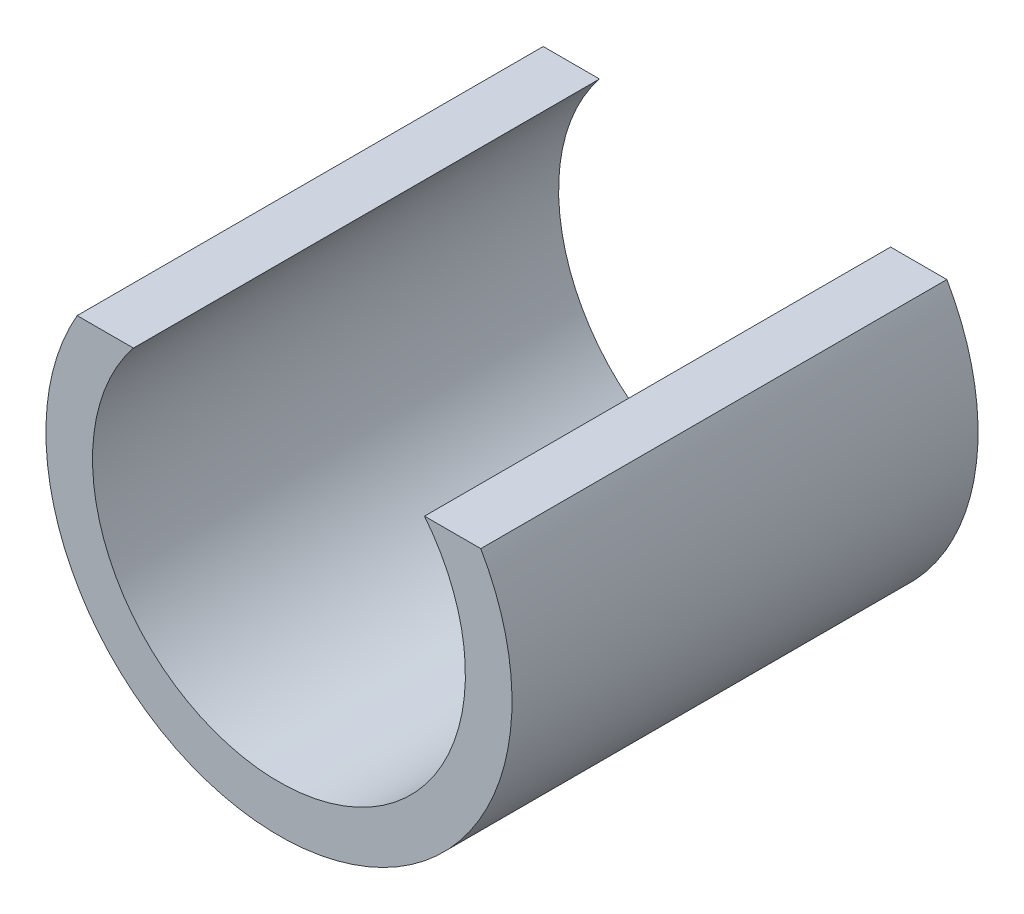
ISO-10303-21;
HEADER;
FILE_DESCRIPTION(('STEP AP214'),'2;1');
FILE_NAME('part.step','',(''),(''),'','','');
FILE_SCHEMA(('AUTOMOTIVE_DESIGN { 1 0 10303 214 1 1 1 1 }'));
ENDSEC;
DATA;
#1=APPLICATION_CONTEXT('core data for automotive mechanical design processes');
#2=APPLICATION_PROTOCOL_DEFINITION('international standard','automotive_design',2000,#1);
#3=PRODUCT_CONTEXT('',#1,'mechanical');
#4=PRODUCT('Part','Part','',(#3));
#5=PRODUCT_RELATED_PRODUCT_CATEGORY('part','',(#4));
#6=PRODUCT_DEFINITION_FORMATION('','',#4);
#7=PRODUCT_DEFINITION_CONTEXT('part definition',#1,'design');
#8=PRODUCT_DEFINITION('design','',#6,#7);
#9=PRODUCT_DEFINITION_SHAPE('','',#8);
#10=(LENGTH_UNIT() NAMED_UNIT(*) SI_UNIT(.MILLI.,.METRE.));
#11=(NAMED_UNIT(*) PLANE_ANGLE_UNIT() SI_UNIT($,.RADIAN.));
#12=(NAMED_UNIT(*) SI_UNIT($,.STERADIAN.) SOLID_ANGLE_UNIT());
#13=UNCERTAINTY_MEASURE_WITH_UNIT(LENGTH_MEASURE(1.E-05),#10,'distance_accuracy_value','');
#14=(GEOMETRIC_REPRESENTATION_CONTEXT(3) GLOBAL_UNCERTAINTY_ASSIGNED_CONTEXT((#13)) GLOBAL_UNIT_ASSIGNED_CONTEXT((#10,
#11,#12)) REPRESENTATION_CONTEXT('',''));
#15=CARTESIAN_POINT('',(0.,0.,0.));
#16=DIRECTION('',(0.,0.,1.));
#17=DIRECTION('',(1.,0.,0.));
#18=AXIS2_PLACEMENT_3D('',#15,#16,#17);
#19=CARTESIAN_POINT('',(0.,0.,4.));
#20=DIRECTION('',(0.,0.,-1.));
#21=DIRECTION('',(-1.,0.,0.));
#22=AXIS2_PLACEMENT_3D('',#19,#20,#21);
#23=CYLINDRICAL_SURFACE('',#22,1.6);
#24=CARTESIAN_POINT('',(0.,0.,0.));
#25=DIRECTION('',(0.,0.,1.));
#26=DIRECTION('',(1.,0.,0.));
#27=AXIS2_PLACEMENT_3D('',#24,#25,#26);
#28=CIRCLE('',#27,1.6);
#29=CARTESIAN_POINT('',(-1.24899959967968,1.,0.));
#30=VERTEX_POINT('',#29);
#31=CARTESIAN_POINT('',(1.24899959967968,1.,0.));
#32=VERTEX_POINT('',#31);
#33=EDGE_CURVE('E98',#30,#32,#28,.T.);
#34=ORIENTED_EDGE('',*,*,#33,.F.);
#35=DIRECTION('',(0.,0.,-1.));
#36=VECTOR('',#35,1.);
#37=CARTESIAN_POINT('',(-1.24899959967968,1.,4.));
#38=LINE('',#37,#36);
#39=CARTESIAN_POINT('',(-1.24899959967968,1.,4.));
#40=VERTEX_POINT('',#39);
#41=EDGE_CURVE('E11',#40,#30,#38,.T.);
#42=ORIENTED_EDGE('',*,*,#41,.F.);
#43=CARTESIAN_POINT('',(0.,0.,4.));
#44=DIRECTION('',(0.,0.,1.));
#45=DIRECTION('',(1.,0.,0.));
#46=AXIS2_PLACEMENT_3D('',#43,#44,#45);
#47=CIRCLE('',#46,1.6);
#48=CARTESIAN_POINT('',(1.24899959967968,1.,4.));
#49=VERTEX_POINT('',#48);
#50=EDGE_CURVE('E87',#40,#49,#47,.T.);
#51=ORIENTED_EDGE('',*,*,#50,.T.);
#52=DIRECTION('',(0.,0.,-1.));
#53=VECTOR('',#52,1.);
#54=CARTESIAN_POINT('',(1.24899959967968,1.,4.));
#55=LINE('',#54,#53);
#56=EDGE_CURVE('E76',#49,#32,#55,.T.);
#57=ORIENTED_EDGE('',*,*,#56,.T.);
#58=EDGE_LOOP('',(#34,#42,#51,#57));
#59=FACE_BOUND('',#58,.T.);
#60=ADVANCED_FACE('F37',(#59),#23,.F.);
#61=CARTESIAN_POINT('',(0.,1.,4.));
#62=DIRECTION('',(0.,-1.,0.));
#63=DIRECTION('',(0.,0.,-1.));
#64=AXIS2_PLACEMENT_3D('',#61,#62,#63);
#65=PLANE('',#64);
#66=DIRECTION('',(-1.,0.,0.));
#67=VECTOR('',#66,1.);
#68=CARTESIAN_POINT('',(0.,1.,0.));
#69=LINE('',#68,#67);
#70=CARTESIAN_POINT('',(-1.73205080756888,1.,0.));
#71=VERTEX_POINT('',#70);
#72=EDGE_CURVE('E92',#30,#71,#69,.T.);
#73=ORIENTED_EDGE('',*,*,#72,.T.);
#74=DIRECTION('',(0.,0.,-1.));
#75=VECTOR('',#74,1.);
#76=CARTESIAN_POINT('',(-1.73205080756888,1.,4.));
#77=LINE('',#76,#75);
#78=CARTESIAN_POINT('',(-1.73205080756888,1.,4.));
#79=VERTEX_POINT('',#78);
#80=EDGE_CURVE('E45',#79,#71,#77,.T.);
#81=ORIENTED_EDGE('',*,*,#80,.F.);
#82=DIRECTION('',(-1.,0.,0.));
#83=VECTOR('',#82,1.);
#84=CARTESIAN_POINT('',(0.,1.,4.));
#85=LINE('',#84,#83);
#86=EDGE_CURVE('E82',#40,#79,#85,.T.);
#87=ORIENTED_EDGE('',*,*,#86,.F.);
#88=ORIENTED_EDGE('',*,*,#41,.T.);
#89=EDGE_LOOP('',(#73,#81,#87,#88));
#90=FACE_BOUND('',#89,.T.);
#91=ADVANCED_FACE('F90',(#90),#65,.F.);
#92=CARTESIAN_POINT('',(0.,0.,4.));
#93=DIRECTION('',(0.,0.,-1.));
#94=DIRECTION('',(-1.,0.,0.));
#95=AXIS2_PLACEMENT_3D('',#92,#93,#94);
#96=CYLINDRICAL_SURFACE('',#95,2.);
#97=CARTESIAN_POINT('',(0.,0.,0.));
#98=DIRECTION('',(0.,0.,1.));
#99=DIRECTION('',(1.,0.,0.));
#100=AXIS2_PLACEMENT_3D('',#97,#98,#99);
#101=CIRCLE('',#100,2.);
#102=CARTESIAN_POINT('',(1.73205080756888,1.,0.));
#103=VERTEX_POINT('',#102);
#104=EDGE_CURVE('E69',#71,#103,#101,.T.);
#105=ORIENTED_EDGE('',*,*,#104,.T.);
#106=DIRECTION('',(0.,0.,-1.));
#107=VECTOR('',#106,1.);
#108=CARTESIAN_POINT('',(1.73205080756888,1.,4.));
#109=LINE('',#108,#107);
#110=CARTESIAN_POINT('',(1.73205080756888,1.,4.));
#111=VERTEX_POINT('',#110);
#112=EDGE_CURVE('E93',#111,#103,#109,.T.);
#113=ORIENTED_EDGE('',*,*,#112,.F.);
#114=CARTESIAN_POINT('',(0.,0.,4.));
#115=DIRECTION('',(0.,0.,1.));
#116=DIRECTION('',(1.,0.,0.));
#117=AXIS2_PLACEMENT_3D('',#114,#115,#116);
#118=CIRCLE('',#117,2.);
#119=EDGE_CURVE('E86',#79,#111,#118,.T.);
#120=ORIENTED_EDGE('',*,*,#119,.F.);
#121=ORIENTED_EDGE('',*,*,#80,.T.);
#122=EDGE_LOOP('',(#105,#113,#120,#121));
#123=FACE_BOUND('',#122,.T.);
#124=ADVANCED_FACE('F94',(#123),#96,.T.);
#125=EDGE_CURVE('E102',#103,#32,#69,.T.);
#126=ORIENTED_EDGE('',*,*,#125,.T.);
#127=ORIENTED_EDGE('',*,*,#56,.F.);
#128=EDGE_CURVE('E53',#111,#49,#85,.T.);
#129=ORIENTED_EDGE('',*,*,#128,.F.);
#130=ORIENTED_EDGE('',*,*,#112,.T.);
#131=EDGE_LOOP('',(#126,#127,#129,#130));
#132=FACE_BOUND('',#131,.T.);
#133=ADVANCED_FACE('F107',(#132),#65,.F.);
#134=CARTESIAN_POINT('',(0.,0.,4.));
#135=DIRECTION('',(0.,0.,1.));
#136=DIRECTION('',(1.,0.,0.));
#137=AXIS2_PLACEMENT_3D('',#134,#135,#136);
#138=PLANE('',#137);
#139=ORIENTED_EDGE('',*,*,#50,.F.);
#140=ORIENTED_EDGE('',*,*,#86,.T.);
#141=ORIENTED_EDGE('',*,*,#119,.T.);
#142=ORIENTED_EDGE('',*,*,#128,.T.);
#143=EDGE_LOOP('',(#139,#140,#141,#142));
#144=FACE_BOUND('',#143,.T.);
#145=ADVANCED_FACE('F84',(#144),#138,.T.);
#146=CARTESIAN_POINT('',(0.,0.,0.));
#147=DIRECTION('',(0.,0.,1.));
#148=DIRECTION('',(1.,0.,0.));
#149=AXIS2_PLACEMENT_3D('',#146,#147,#148);
#150=PLANE('',#149);
#151=ORIENTED_EDGE('',*,*,#33,.T.);
#152=ORIENTED_EDGE('',*,*,#125,.F.);
#153=ORIENTED_EDGE('',*,*,#104,.F.);
#154=ORIENTED_EDGE('',*,*,#72,.F.);
#155=EDGE_LOOP('',(#151,#152,#153,#154));
#156=FACE_BOUND('',#155,.T.);
#157=ADVANCED_FACE('F109',(#156),#150,.F.);
#158=CLOSED_SHELL('',(#60,#91,#124,#133,#145,#157));
#159=MANIFOLD_SOLID_BREP('B2',#158);
#160=ADVANCED_BREP_SHAPE_REPRESENTATION('',(#18,#159),#14);
#161=SHAPE_DEFINITION_REPRESENTATION(#9,#160);
ENDSEC;
END-ISO-10303-21;
